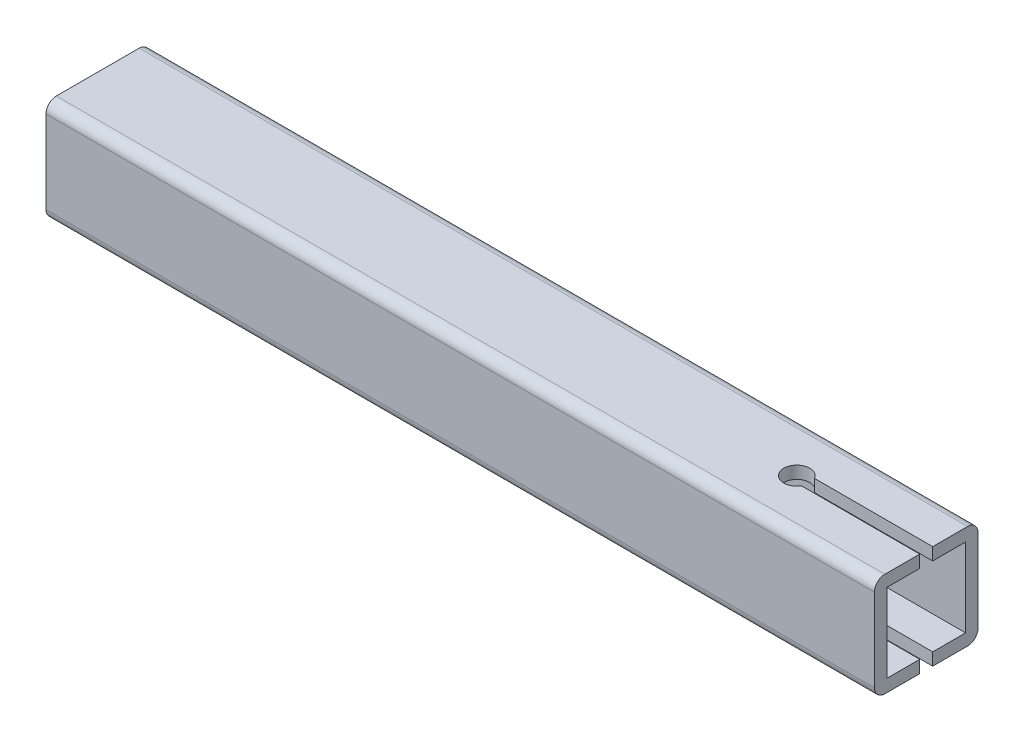
ISO-10303-21;
HEADER;
FILE_DESCRIPTION(('STEP AP214'),'2;1');
FILE_NAME('part.step','',(''),(''),'','','');
FILE_SCHEMA(('AUTOMOTIVE_DESIGN { 1 0 10303 214 1 1 1 1 }'));
ENDSEC;
DATA;
#1=APPLICATION_CONTEXT('core data for automotive mechanical design processes');
#2=APPLICATION_PROTOCOL_DEFINITION('international standard','automotive_design',2000,#1);
#3=PRODUCT_CONTEXT('',#1,'mechanical');
#4=PRODUCT('Part','Part','',(#3));
#5=PRODUCT_RELATED_PRODUCT_CATEGORY('part','',(#4));
#6=PRODUCT_DEFINITION_FORMATION('','',#4);
#7=PRODUCT_DEFINITION_CONTEXT('part definition',#1,'design');
#8=PRODUCT_DEFINITION('design','',#6,#7);
#9=PRODUCT_DEFINITION_SHAPE('','',#8);
#10=(LENGTH_UNIT() NAMED_UNIT(*) SI_UNIT(.MILLI.,.METRE.));
#11=(NAMED_UNIT(*) PLANE_ANGLE_UNIT() SI_UNIT($,.RADIAN.));
#12=(NAMED_UNIT(*) SI_UNIT($,.STERADIAN.) SOLID_ANGLE_UNIT());
#13=UNCERTAINTY_MEASURE_WITH_UNIT(LENGTH_MEASURE(1.E-05),#10,'distance_accuracy_value','');
#14=(GEOMETRIC_REPRESENTATION_CONTEXT(3) GLOBAL_UNCERTAINTY_ASSIGNED_CONTEXT((#13)) GLOBAL_UNIT_ASSIGNED_CONTEXT((#10,
#11,#12)) REPRESENTATION_CONTEXT('',''));
#15=CARTESIAN_POINT('',(0.,0.,0.));
#16=DIRECTION('',(0.,0.,1.));
#17=DIRECTION('',(1.,0.,0.));
#18=AXIS2_PLACEMENT_3D('',#15,#16,#17);
#19=CARTESIAN_POINT('',(203.2,2.54,22.86));
#20=DIRECTION('',(1.,0.,0.));
#21=DIRECTION('',(0.,0.,-1.));
#22=AXIS2_PLACEMENT_3D('',#19,#20,#21);
#23=PLANE('',#22);
#24=DIRECTION('',(0.,1.,0.));
#25=VECTOR('',#24,1.);
#26=CARTESIAN_POINT('',(203.2,0.,14.2875));
#27=LINE('',#26,#25);
#28=CARTESIAN_POINT('',(203.2,22.352,14.2875));
#29=VERTEX_POINT('',#28);
#30=CARTESIAN_POINT('',(203.2,25.4,14.2875));
#31=VERTEX_POINT('',#30);
#32=EDGE_CURVE('E327',#29,#31,#27,.T.);
#33=ORIENTED_EDGE('',*,*,#32,.T.);
#34=DIRECTION('',(0.,0.,1.));
#35=VECTOR('',#34,1.);
#36=CARTESIAN_POINT('',(203.2,25.4,2.54));
#37=LINE('',#36,#35);
#38=CARTESIAN_POINT('',(203.2,25.4,22.86));
#39=VERTEX_POINT('',#38);
#40=EDGE_CURVE('E247',#31,#39,#37,.T.);
#41=ORIENTED_EDGE('',*,*,#40,.T.);
#42=CARTESIAN_POINT('',(203.2,22.86,22.86));
#43=DIRECTION('',(1.,0.,0.));
#44=DIRECTION('',(0.,0.,1.));
#45=AXIS2_PLACEMENT_3D('',#42,#43,#44);
#46=CIRCLE('',#45,2.54);
#47=CARTESIAN_POINT('',(203.2,22.86,25.4));
#48=VERTEX_POINT('',#47);
#49=EDGE_CURVE('E251',#39,#48,#46,.T.);
#50=ORIENTED_EDGE('',*,*,#49,.T.);
#51=DIRECTION('',(0.,-1.,0.));
#52=VECTOR('',#51,1.);
#53=CARTESIAN_POINT('',(203.2,22.86,25.4));
#54=LINE('',#53,#52);
#55=CARTESIAN_POINT('',(203.2,2.54,25.4));
#56=VERTEX_POINT('',#55);
#57=EDGE_CURVE('E253',#48,#56,#54,.T.);
#58=ORIENTED_EDGE('',*,*,#57,.T.);
#59=CARTESIAN_POINT('',(203.2,2.54,22.86));
#60=DIRECTION('',(1.,0.,0.));
#61=DIRECTION('',(0.,0.,-1.));
#62=AXIS2_PLACEMENT_3D('',#59,#60,#61);
#63=CIRCLE('',#62,2.54);
#64=CARTESIAN_POINT('',(203.2,0.,22.86));
#65=VERTEX_POINT('',#64);
#66=EDGE_CURVE('E233',#56,#65,#63,.T.);
#67=ORIENTED_EDGE('',*,*,#66,.T.);
#68=DIRECTION('',(0.,0.,-1.));
#69=VECTOR('',#68,1.);
#70=CARTESIAN_POINT('',(203.2,0.,22.86));
#71=LINE('',#70,#69);
#72=CARTESIAN_POINT('',(203.2,0.,14.2875));
#73=VERTEX_POINT('',#72);
#74=EDGE_CURVE('E238',#65,#73,#71,.T.);
#75=ORIENTED_EDGE('',*,*,#74,.T.);
#76=CARTESIAN_POINT('',(203.2,3.048,14.2875));
#77=VERTEX_POINT('',#76);
#78=EDGE_CURVE('E318',#73,#77,#27,.T.);
#79=ORIENTED_EDGE('',*,*,#78,.T.);
#80=DIRECTION('',(0.,0.,-1.));
#81=VECTOR('',#80,1.);
#82=CARTESIAN_POINT('',(203.2,3.048,22.352));
#83=LINE('',#82,#81);
#84=CARTESIAN_POINT('',(203.2,3.048,22.352));
#85=VERTEX_POINT('',#84);
#86=EDGE_CURVE('E211',#85,#77,#83,.T.);
#87=ORIENTED_EDGE('',*,*,#86,.F.);
#88=DIRECTION('',(0.,-1.,0.));
#89=VECTOR('',#88,1.);
#90=CARTESIAN_POINT('',(203.2,22.352,22.352));
#91=LINE('',#90,#89);
#92=CARTESIAN_POINT('',(203.2,22.352,22.352));
#93=VERTEX_POINT('',#92);
#94=EDGE_CURVE('E200',#93,#85,#91,.T.);
#95=ORIENTED_EDGE('',*,*,#94,.F.);
#96=DIRECTION('',(0.,0.,1.));
#97=VECTOR('',#96,1.);
#98=CARTESIAN_POINT('',(203.2,22.352,3.048));
#99=LINE('',#98,#97);
#100=EDGE_CURVE('E184',#29,#93,#99,.T.);
#101=ORIENTED_EDGE('',*,*,#100,.F.);
#102=EDGE_LOOP('',(#33,#41,#50,#58,#67,#75,#79,#87,#95,#101));
#103=FACE_BOUND('',#102,.T.);
#104=ADVANCED_FACE('F41',(#103),#23,.T.);
#105=DIRECTION('',(0.,1.,0.));
#106=VECTOR('',#105,1.);
#107=CARTESIAN_POINT('',(203.2,0.,11.1125));
#108=LINE('',#107,#106);
#109=CARTESIAN_POINT('',(203.2,0.,11.1125));
#110=VERTEX_POINT('',#109);
#111=CARTESIAN_POINT('',(203.2,3.048,11.1125));
#112=VERTEX_POINT('',#111);
#113=EDGE_CURVE('E59',#110,#112,#108,.T.);
#114=ORIENTED_EDGE('',*,*,#113,.F.);
#115=CARTESIAN_POINT('',(203.2,0.,2.54000000000002));
#116=VERTEX_POINT('',#115);
#117=EDGE_CURVE('E236',#110,#116,#71,.T.);
#118=ORIENTED_EDGE('',*,*,#117,.T.);
#119=CARTESIAN_POINT('',(203.2,2.54,2.54));
#120=DIRECTION('',(1.,0.,0.));
#121=DIRECTION('',(0.,0.,1.));
#122=AXIS2_PLACEMENT_3D('',#119,#120,#121);
#123=CIRCLE('',#122,2.54);
#124=CARTESIAN_POINT('',(203.2,2.54000000000002,0.));
#125=VERTEX_POINT('',#124);
#126=EDGE_CURVE('E241',#116,#125,#123,.T.);
#127=ORIENTED_EDGE('',*,*,#126,.T.);
#128=DIRECTION('',(0.,1.,0.));
#129=VECTOR('',#128,1.);
#130=CARTESIAN_POINT('',(203.2,2.54000000000002,0.));
#131=LINE('',#130,#129);
#132=CARTESIAN_POINT('',(203.2,22.86,0.));
#133=VERTEX_POINT('',#132);
#134=EDGE_CURVE('E243',#125,#133,#131,.T.);
#135=ORIENTED_EDGE('',*,*,#134,.T.);
#136=CARTESIAN_POINT('',(203.2,22.86,2.54));
#137=DIRECTION('',(1.,0.,0.));
#138=DIRECTION('',(0.,0.,-1.));
#139=AXIS2_PLACEMENT_3D('',#136,#137,#138);
#140=CIRCLE('',#139,2.54);
#141=CARTESIAN_POINT('',(203.2,25.4,2.54));
#142=VERTEX_POINT('',#141);
#143=EDGE_CURVE('E245',#133,#142,#140,.T.);
#144=ORIENTED_EDGE('',*,*,#143,.T.);
#145=CARTESIAN_POINT('',(203.2,25.4,11.1125));
#146=VERTEX_POINT('',#145);
#147=EDGE_CURVE('E248',#142,#146,#37,.T.);
#148=ORIENTED_EDGE('',*,*,#147,.T.);
#149=CARTESIAN_POINT('',(203.2,22.352,11.1125));
#150=VERTEX_POINT('',#149);
#151=EDGE_CURVE('E306',#150,#146,#108,.T.);
#152=ORIENTED_EDGE('',*,*,#151,.F.);
#153=CARTESIAN_POINT('',(203.2,22.352,3.048));
#154=VERTEX_POINT('',#153);
#155=EDGE_CURVE('E194',#154,#150,#99,.T.);
#156=ORIENTED_EDGE('',*,*,#155,.F.);
#157=DIRECTION('',(0.,1.,0.));
#158=VECTOR('',#157,1.);
#159=CARTESIAN_POINT('',(203.2,3.048,3.048));
#160=LINE('',#159,#158);
#161=CARTESIAN_POINT('',(203.2,3.048,3.048));
#162=VERTEX_POINT('',#161);
#163=EDGE_CURVE('E195',#162,#154,#160,.T.);
#164=ORIENTED_EDGE('',*,*,#163,.F.);
#165=EDGE_CURVE('E226',#112,#162,#83,.T.);
#166=ORIENTED_EDGE('',*,*,#165,.F.);
#167=EDGE_LOOP('',(#114,#118,#127,#135,#144,#148,#152,#156,#164,#166));
#168=FACE_BOUND('',#167,.T.);
#169=ADVANCED_FACE('F308',(#168),#23,.T.);
#170=CARTESIAN_POINT('',(0.,2.54,22.86));
#171=DIRECTION('',(1.,0.,0.));
#172=DIRECTION('',(0.,0.,-1.));
#173=AXIS2_PLACEMENT_3D('',#170,#171,#172);
#174=PLANE('',#173);
#175=CARTESIAN_POINT('',(0.,2.54,22.86));
#176=DIRECTION('',(1.,0.,0.));
#177=DIRECTION('',(0.,0.,-1.));
#178=AXIS2_PLACEMENT_3D('',#175,#176,#177);
#179=CIRCLE('',#178,2.54);
#180=CARTESIAN_POINT('',(0.,2.54,25.4));
#181=VERTEX_POINT('',#180);
#182=CARTESIAN_POINT('',(0.,0.,22.86));
#183=VERTEX_POINT('',#182);
#184=EDGE_CURVE('E232',#181,#183,#179,.T.);
#185=ORIENTED_EDGE('',*,*,#184,.F.);
#186=DIRECTION('',(0.,-1.,0.));
#187=VECTOR('',#186,1.);
#188=CARTESIAN_POINT('',(0.,22.86,25.4));
#189=LINE('',#188,#187);
#190=CARTESIAN_POINT('',(0.,22.86,25.4));
#191=VERTEX_POINT('',#190);
#192=EDGE_CURVE('E237',#191,#181,#189,.T.);
#193=ORIENTED_EDGE('',*,*,#192,.F.);
#194=CARTESIAN_POINT('',(0.,22.86,22.86));
#195=DIRECTION('',(1.,0.,0.));
#196=DIRECTION('',(0.,0.,1.));
#197=AXIS2_PLACEMENT_3D('',#194,#195,#196);
#198=CIRCLE('',#197,2.54);
#199=CARTESIAN_POINT('',(0.,25.4,22.86));
#200=VERTEX_POINT('',#199);
#201=EDGE_CURVE('E268',#200,#191,#198,.T.);
#202=ORIENTED_EDGE('',*,*,#201,.F.);
#203=DIRECTION('',(0.,0.,1.));
#204=VECTOR('',#203,1.);
#205=CARTESIAN_POINT('',(0.,25.4,2.54));
#206=LINE('',#205,#204);
#207=CARTESIAN_POINT('',(0.,25.4,2.54));
#208=VERTEX_POINT('',#207);
#209=EDGE_CURVE('E266',#208,#200,#206,.T.);
#210=ORIENTED_EDGE('',*,*,#209,.F.);
#211=CARTESIAN_POINT('',(0.,22.86,2.54));
#212=DIRECTION('',(1.,0.,0.));
#213=DIRECTION('',(0.,0.,-1.));
#214=AXIS2_PLACEMENT_3D('',#211,#212,#213);
#215=CIRCLE('',#214,2.54);
#216=CARTESIAN_POINT('',(0.,22.86,0.));
#217=VERTEX_POINT('',#216);
#218=EDGE_CURVE('E264',#217,#208,#215,.T.);
#219=ORIENTED_EDGE('',*,*,#218,.F.);
#220=DIRECTION('',(0.,1.,0.));
#221=VECTOR('',#220,1.);
#222=CARTESIAN_POINT('',(0.,2.54000000000002,0.));
#223=LINE('',#222,#221);
#224=CARTESIAN_POINT('',(0.,2.54000000000002,0.));
#225=VERTEX_POINT('',#224);
#226=EDGE_CURVE('E262',#225,#217,#223,.T.);
#227=ORIENTED_EDGE('',*,*,#226,.F.);
#228=CARTESIAN_POINT('',(0.,2.54,2.54));
#229=DIRECTION('',(1.,0.,0.));
#230=DIRECTION('',(0.,0.,1.));
#231=AXIS2_PLACEMENT_3D('',#228,#229,#230);
#232=CIRCLE('',#231,2.54);
#233=CARTESIAN_POINT('',(0.,0.,2.54000000000002));
#234=VERTEX_POINT('',#233);
#235=EDGE_CURVE('E260',#234,#225,#232,.T.);
#236=ORIENTED_EDGE('',*,*,#235,.F.);
#237=DIRECTION('',(0.,0.,-1.));
#238=VECTOR('',#237,1.);
#239=CARTESIAN_POINT('',(0.,0.,22.86));
#240=LINE('',#239,#238);
#241=EDGE_CURVE('E258',#183,#234,#240,.T.);
#242=ORIENTED_EDGE('',*,*,#241,.F.);
#243=EDGE_LOOP('',(#185,#193,#202,#210,#219,#227,#236,#242));
#244=FACE_BOUND('',#243,.T.);
#245=DIRECTION('',(0.,0.,-1.));
#246=VECTOR('',#245,1.);
#247=CARTESIAN_POINT('',(0.,3.048,22.352));
#248=LINE('',#247,#246);
#249=CARTESIAN_POINT('',(0.,3.048,22.352));
#250=VERTEX_POINT('',#249);
#251=CARTESIAN_POINT('',(0.,3.048,3.048));
#252=VERTEX_POINT('',#251);
#253=EDGE_CURVE('E217',#250,#252,#248,.T.);
#254=ORIENTED_EDGE('',*,*,#253,.T.);
#255=DIRECTION('',(0.,1.,0.));
#256=VECTOR('',#255,1.);
#257=CARTESIAN_POINT('',(0.,3.048,3.048));
#258=LINE('',#257,#256);
#259=CARTESIAN_POINT('',(0.,22.352,3.048));
#260=VERTEX_POINT('',#259);
#261=EDGE_CURVE('E220',#252,#260,#258,.T.);
#262=ORIENTED_EDGE('',*,*,#261,.T.);
#263=DIRECTION('',(0.,0.,1.));
#264=VECTOR('',#263,1.);
#265=CARTESIAN_POINT('',(0.,22.352,3.048));
#266=LINE('',#265,#264);
#267=CARTESIAN_POINT('',(0.,22.352,22.352));
#268=VERTEX_POINT('',#267);
#269=EDGE_CURVE('E224',#260,#268,#266,.T.);
#270=ORIENTED_EDGE('',*,*,#269,.T.);
#271=DIRECTION('',(0.,-1.,0.));
#272=VECTOR('',#271,1.);
#273=CARTESIAN_POINT('',(0.,22.352,22.352));
#274=LINE('',#273,#272);
#275=EDGE_CURVE('E203',#268,#250,#274,.T.);
#276=ORIENTED_EDGE('',*,*,#275,.T.);
#277=EDGE_LOOP('',(#254,#262,#270,#276));
#278=FACE_BOUND('',#277,.T.);
#279=ADVANCED_FACE('F344',(#244,#278),#174,.F.);
#280=CARTESIAN_POINT('',(203.2,2.54,22.86));
#281=DIRECTION('',(-1.,0.,0.));
#282=DIRECTION('',(0.,0.,1.));
#283=AXIS2_PLACEMENT_3D('',#280,#281,#282);
#284=CYLINDRICAL_SURFACE('',#283,2.54);
#285=ORIENTED_EDGE('',*,*,#184,.T.);
#286=DIRECTION('',(-1.,0.,0.));
#287=VECTOR('',#286,1.);
#288=CARTESIAN_POINT('',(203.2,0.,22.86));
#289=LINE('',#288,#287);
#290=EDGE_CURVE('E291',#65,#183,#289,.T.);
#291=ORIENTED_EDGE('',*,*,#290,.F.);
#292=ORIENTED_EDGE('',*,*,#66,.F.);
#293=DIRECTION('',(-1.,0.,0.));
#294=VECTOR('',#293,1.);
#295=CARTESIAN_POINT('',(203.2,2.54,25.4));
#296=LINE('',#295,#294);
#297=EDGE_CURVE('E255',#56,#181,#296,.T.);
#298=ORIENTED_EDGE('',*,*,#297,.T.);
#299=EDGE_LOOP('',(#285,#291,#292,#298));
#300=FACE_BOUND('',#299,.T.);
#301=ADVANCED_FACE('F43',(#300),#284,.T.);
#302=CARTESIAN_POINT('',(203.2,0.,22.86));
#303=DIRECTION('',(0.,1.,0.));
#304=DIRECTION('',(0.,0.,1.));
#305=AXIS2_PLACEMENT_3D('',#302,#303,#304);
#306=PLANE('',#305);
#307=CARTESIAN_POINT('',(171.45,0.,12.7));
#308=DIRECTION('',(0.,1.,0.));
#309=DIRECTION('',(0.,0.,1.));
#310=AXIS2_PLACEMENT_3D('',#307,#308,#309);
#311=CIRCLE('',#310,3.17499999999999);
#312=CARTESIAN_POINT('',(174.199630657016,0.,11.1125));
#313=VERTEX_POINT('',#312);
#314=CARTESIAN_POINT('',(174.199630657016,0.,14.2875));
#315=VERTEX_POINT('',#314);
#316=EDGE_CURVE('E314',#313,#315,#311,.T.);
#317=ORIENTED_EDGE('',*,*,#316,.T.);
#318=DIRECTION('',(1.,0.,0.));
#319=VECTOR('',#318,1.);
#320=CARTESIAN_POINT('',(203.2,0.,14.2875));
#321=LINE('',#320,#319);
#322=EDGE_CURVE('E311',#315,#73,#321,.T.);
#323=ORIENTED_EDGE('',*,*,#322,.T.);
#324=ORIENTED_EDGE('',*,*,#74,.F.);
#325=ORIENTED_EDGE('',*,*,#290,.T.);
#326=ORIENTED_EDGE('',*,*,#241,.T.);
#327=DIRECTION('',(-1.,0.,0.));
#328=VECTOR('',#327,1.);
#329=CARTESIAN_POINT('',(203.2,0.,2.54000000000002));
#330=LINE('',#329,#328);
#331=EDGE_CURVE('E288',#116,#234,#330,.T.);
#332=ORIENTED_EDGE('',*,*,#331,.F.);
#333=ORIENTED_EDGE('',*,*,#117,.F.);
#334=DIRECTION('',(-1.,0.,0.));
#335=VECTOR('',#334,1.);
#336=CARTESIAN_POINT('',(203.2,0.,11.1125));
#337=LINE('',#336,#335);
#338=EDGE_CURVE('E83',#110,#313,#337,.T.);
#339=ORIENTED_EDGE('',*,*,#338,.T.);
#340=EDGE_LOOP('',(#317,#323,#324,#325,#326,#332,#333,#339));
#341=FACE_BOUND('',#340,.T.);
#342=ADVANCED_FACE('F353',(#341),#306,.F.);
#343=CARTESIAN_POINT('',(203.2,2.54,2.54));
#344=DIRECTION('',(-1.,0.,0.));
#345=DIRECTION('',(0.,0.,1.));
#346=AXIS2_PLACEMENT_3D('',#343,#344,#345);
#347=CYLINDRICAL_SURFACE('',#346,2.54);
#348=ORIENTED_EDGE('',*,*,#235,.T.);
#349=DIRECTION('',(-1.,0.,0.));
#350=VECTOR('',#349,1.);
#351=CARTESIAN_POINT('',(203.2,2.54000000000002,0.));
#352=LINE('',#351,#350);
#353=EDGE_CURVE('E285',#125,#225,#352,.T.);
#354=ORIENTED_EDGE('',*,*,#353,.F.);
#355=ORIENTED_EDGE('',*,*,#126,.F.);
#356=ORIENTED_EDGE('',*,*,#331,.T.);
#357=EDGE_LOOP('',(#348,#354,#355,#356));
#358=FACE_BOUND('',#357,.T.);
#359=ADVANCED_FACE('F358',(#358),#347,.T.);
#360=CARTESIAN_POINT('',(203.2,2.54000000000002,0.));
#361=DIRECTION('',(0.,0.,1.));
#362=DIRECTION('',(1.,0.,0.));
#363=AXIS2_PLACEMENT_3D('',#360,#361,#362);
#364=PLANE('',#363);
#365=ORIENTED_EDGE('',*,*,#226,.T.);
#366=DIRECTION('',(-1.,0.,0.));
#367=VECTOR('',#366,1.);
#368=CARTESIAN_POINT('',(203.2,22.86,0.));
#369=LINE('',#368,#367);
#370=EDGE_CURVE('E282',#133,#217,#369,.T.);
#371=ORIENTED_EDGE('',*,*,#370,.F.);
#372=ORIENTED_EDGE('',*,*,#134,.F.);
#373=ORIENTED_EDGE('',*,*,#353,.T.);
#374=EDGE_LOOP('',(#365,#371,#372,#373));
#375=FACE_BOUND('',#374,.T.);
#376=ADVANCED_FACE('F364',(#375),#364,.F.);
#377=CARTESIAN_POINT('',(203.2,22.86,2.54));
#378=DIRECTION('',(-1.,0.,0.));
#379=DIRECTION('',(0.,0.,1.));
#380=AXIS2_PLACEMENT_3D('',#377,#378,#379);
#381=CYLINDRICAL_SURFACE('',#380,2.54);
#382=ORIENTED_EDGE('',*,*,#218,.T.);
#383=DIRECTION('',(-1.,0.,0.));
#384=VECTOR('',#383,1.);
#385=CARTESIAN_POINT('',(203.2,25.4,2.54));
#386=LINE('',#385,#384);
#387=EDGE_CURVE('E279',#142,#208,#386,.T.);
#388=ORIENTED_EDGE('',*,*,#387,.F.);
#389=ORIENTED_EDGE('',*,*,#143,.F.);
#390=ORIENTED_EDGE('',*,*,#370,.T.);
#391=EDGE_LOOP('',(#382,#388,#389,#390));
#392=FACE_BOUND('',#391,.T.);
#393=ADVANCED_FACE('F368',(#392),#381,.T.);
#394=CARTESIAN_POINT('',(203.2,25.4,2.54));
#395=DIRECTION('',(0.,-1.,0.));
#396=DIRECTION('',(0.,0.,-1.));
#397=AXIS2_PLACEMENT_3D('',#394,#395,#396);
#398=PLANE('',#397);
#399=ORIENTED_EDGE('',*,*,#40,.F.);
#400=DIRECTION('',(-1.,0.,0.));
#401=VECTOR('',#400,1.);
#402=CARTESIAN_POINT('',(203.2,25.4,14.2875));
#403=LINE('',#402,#401);
#404=CARTESIAN_POINT('',(174.199630657016,25.4,14.2875));
#405=VERTEX_POINT('',#404);
#406=EDGE_CURVE('E221',#31,#405,#403,.T.);
#407=ORIENTED_EDGE('',*,*,#406,.T.);
#408=CARTESIAN_POINT('',(171.45,25.4,12.7));
#409=DIRECTION('',(0.,1.,0.));
#410=DIRECTION('',(0.,0.,1.));
#411=AXIS2_PLACEMENT_3D('',#408,#409,#410);
#412=CIRCLE('',#411,3.17499999999999);
#413=CARTESIAN_POINT('',(174.199630657016,25.4,11.1125));
#414=VERTEX_POINT('',#413);
#415=EDGE_CURVE('E45',#414,#405,#412,.T.);
#416=ORIENTED_EDGE('',*,*,#415,.F.);
#417=DIRECTION('',(1.,0.,0.));
#418=VECTOR('',#417,1.);
#419=CARTESIAN_POINT('',(203.2,25.4,11.1125));
#420=LINE('',#419,#418);
#421=EDGE_CURVE('E70',#414,#146,#420,.T.);
#422=ORIENTED_EDGE('',*,*,#421,.T.);
#423=ORIENTED_EDGE('',*,*,#147,.F.);
#424=ORIENTED_EDGE('',*,*,#387,.T.);
#425=ORIENTED_EDGE('',*,*,#209,.T.);
#426=DIRECTION('',(-1.,0.,0.));
#427=VECTOR('',#426,1.);
#428=CARTESIAN_POINT('',(203.2,25.4,22.86));
#429=LINE('',#428,#427);
#430=EDGE_CURVE('E276',#39,#200,#429,.T.);
#431=ORIENTED_EDGE('',*,*,#430,.F.);
#432=EDGE_LOOP('',(#399,#407,#416,#422,#423,#424,#425,#431));
#433=FACE_BOUND('',#432,.T.);
#434=ADVANCED_FACE('F372',(#433),#398,.F.);
#435=CARTESIAN_POINT('',(203.2,22.86,22.86));
#436=DIRECTION('',(-1.,0.,0.));
#437=DIRECTION('',(0.,0.,1.));
#438=AXIS2_PLACEMENT_3D('',#435,#436,#437);
#439=CYLINDRICAL_SURFACE('',#438,2.54);
#440=ORIENTED_EDGE('',*,*,#201,.T.);
#441=DIRECTION('',(-1.,0.,0.));
#442=VECTOR('',#441,1.);
#443=CARTESIAN_POINT('',(203.2,22.86,25.4));
#444=LINE('',#443,#442);
#445=EDGE_CURVE('E273',#48,#191,#444,.T.);
#446=ORIENTED_EDGE('',*,*,#445,.F.);
#447=ORIENTED_EDGE('',*,*,#49,.F.);
#448=ORIENTED_EDGE('',*,*,#430,.T.);
#449=EDGE_LOOP('',(#440,#446,#447,#448));
#450=FACE_BOUND('',#449,.T.);
#451=ADVANCED_FACE('F405',(#450),#439,.T.);
#452=CARTESIAN_POINT('',(203.2,22.86,25.4));
#453=DIRECTION('',(0.,0.,-1.));
#454=DIRECTION('',(0.,1.,0.));
#455=AXIS2_PLACEMENT_3D('',#452,#453,#454);
#456=PLANE('',#455);
#457=ORIENTED_EDGE('',*,*,#192,.T.);
#458=ORIENTED_EDGE('',*,*,#297,.F.);
#459=ORIENTED_EDGE('',*,*,#57,.F.);
#460=ORIENTED_EDGE('',*,*,#445,.T.);
#461=EDGE_LOOP('',(#457,#458,#459,#460));
#462=FACE_BOUND('',#461,.T.);
#463=ADVANCED_FACE('F402',(#462),#456,.F.);
#464=CARTESIAN_POINT('',(203.2,3.048,22.352));
#465=DIRECTION('',(0.,1.,0.));
#466=DIRECTION('',(0.,0.,1.));
#467=AXIS2_PLACEMENT_3D('',#464,#465,#466);
#468=PLANE('',#467);
#469=DIRECTION('',(1.,0.,0.));
#470=VECTOR('',#469,1.);
#471=CARTESIAN_POINT('',(203.2,3.048,14.2875));
#472=LINE('',#471,#470);
#473=CARTESIAN_POINT('',(174.199630657016,3.048,14.2875));
#474=VERTEX_POINT('',#473);
#475=EDGE_CURVE('E335',#474,#77,#472,.T.);
#476=ORIENTED_EDGE('',*,*,#475,.F.);
#477=CARTESIAN_POINT('',(171.45,3.048,12.7));
#478=DIRECTION('',(0.,1.,0.));
#479=DIRECTION('',(0.,0.,1.));
#480=AXIS2_PLACEMENT_3D('',#477,#478,#479);
#481=CIRCLE('',#480,3.17499999999999);
#482=CARTESIAN_POINT('',(174.199630657016,3.048,11.1125));
#483=VERTEX_POINT('',#482);
#484=EDGE_CURVE('E333',#483,#474,#481,.T.);
#485=ORIENTED_EDGE('',*,*,#484,.F.);
#486=DIRECTION('',(-1.,0.,0.));
#487=VECTOR('',#486,1.);
#488=CARTESIAN_POINT('',(203.2,3.048,11.1125));
#489=LINE('',#488,#487);
#490=EDGE_CURVE('E330',#112,#483,#489,.T.);
#491=ORIENTED_EDGE('',*,*,#490,.F.);
#492=ORIENTED_EDGE('',*,*,#165,.T.);
#493=DIRECTION('',(-1.,0.,0.));
#494=VECTOR('',#493,1.);
#495=CARTESIAN_POINT('',(203.2,3.048,3.048));
#496=LINE('',#495,#494);
#497=EDGE_CURVE('E229',#162,#252,#496,.T.);
#498=ORIENTED_EDGE('',*,*,#497,.T.);
#499=ORIENTED_EDGE('',*,*,#253,.F.);
#500=DIRECTION('',(-1.,0.,0.));
#501=VECTOR('',#500,1.);
#502=CARTESIAN_POINT('',(203.2,3.048,22.352));
#503=LINE('',#502,#501);
#504=EDGE_CURVE('E206',#85,#250,#503,.T.);
#505=ORIENTED_EDGE('',*,*,#504,.F.);
#506=ORIENTED_EDGE('',*,*,#86,.T.);
#507=EDGE_LOOP('',(#476,#485,#491,#492,#498,#499,#505,#506));
#508=FACE_BOUND('',#507,.T.);
#509=ADVANCED_FACE('F347',(#508),#468,.T.);
#510=CARTESIAN_POINT('',(203.2,3.048,3.048));
#511=DIRECTION('',(0.,0.,1.));
#512=DIRECTION('',(1.,0.,0.));
#513=AXIS2_PLACEMENT_3D('',#510,#511,#512);
#514=PLANE('',#513);
#515=ORIENTED_EDGE('',*,*,#261,.F.);
#516=ORIENTED_EDGE('',*,*,#497,.F.);
#517=ORIENTED_EDGE('',*,*,#163,.T.);
#518=DIRECTION('',(-1.,0.,0.));
#519=VECTOR('',#518,1.);
#520=CARTESIAN_POINT('',(203.2,22.352,3.048));
#521=LINE('',#520,#519);
#522=EDGE_CURVE('E205',#154,#260,#521,.T.);
#523=ORIENTED_EDGE('',*,*,#522,.T.);
#524=EDGE_LOOP('',(#515,#516,#517,#523));
#525=FACE_BOUND('',#524,.T.);
#526=ADVANCED_FACE('F341',(#525),#514,.T.);
#527=CARTESIAN_POINT('',(203.2,22.352,3.048));
#528=DIRECTION('',(0.,-1.,0.));
#529=DIRECTION('',(0.,0.,-1.));
#530=AXIS2_PLACEMENT_3D('',#527,#528,#529);
#531=PLANE('',#530);
#532=DIRECTION('',(-1.,0.,0.));
#533=VECTOR('',#532,1.);
#534=CARTESIAN_POINT('',(203.2,22.352,14.2875));
#535=LINE('',#534,#533);
#536=CARTESIAN_POINT('',(174.199630657016,22.352,14.2875));
#537=VERTEX_POINT('',#536);
#538=EDGE_CURVE('E11',#29,#537,#535,.T.);
#539=ORIENTED_EDGE('',*,*,#538,.F.);
#540=ORIENTED_EDGE('',*,*,#100,.T.);
#541=DIRECTION('',(-1.,0.,0.));
#542=VECTOR('',#541,1.);
#543=CARTESIAN_POINT('',(203.2,22.352,22.352));
#544=LINE('',#543,#542);
#545=EDGE_CURVE('E188',#93,#268,#544,.T.);
#546=ORIENTED_EDGE('',*,*,#545,.T.);
#547=ORIENTED_EDGE('',*,*,#269,.F.);
#548=ORIENTED_EDGE('',*,*,#522,.F.);
#549=ORIENTED_EDGE('',*,*,#155,.T.);
#550=DIRECTION('',(1.,0.,0.));
#551=VECTOR('',#550,1.);
#552=CARTESIAN_POINT('',(203.2,22.352,11.1125));
#553=LINE('',#552,#551);
#554=CARTESIAN_POINT('',(174.199630657016,22.352,11.1125));
#555=VERTEX_POINT('',#554);
#556=EDGE_CURVE('E294',#555,#150,#553,.T.);
#557=ORIENTED_EDGE('',*,*,#556,.F.);
#558=CARTESIAN_POINT('',(171.45,22.352,12.7));
#559=DIRECTION('',(0.,-1.,0.));
#560=DIRECTION('',(0.,0.,-1.));
#561=AXIS2_PLACEMENT_3D('',#558,#559,#560);
#562=CIRCLE('',#561,3.17499999999999);
#563=EDGE_CURVE('E51',#537,#555,#562,.T.);
#564=ORIENTED_EDGE('',*,*,#563,.F.);
#565=EDGE_LOOP('',(#539,#540,#546,#547,#548,#549,#557,#564));
#566=FACE_BOUND('',#565,.T.);
#567=ADVANCED_FACE('F186',(#566),#531,.T.);
#568=CARTESIAN_POINT('',(203.2,22.352,22.352));
#569=DIRECTION('',(0.,0.,-1.));
#570=DIRECTION('',(0.,1.,0.));
#571=AXIS2_PLACEMENT_3D('',#568,#569,#570);
#572=PLANE('',#571);
#573=ORIENTED_EDGE('',*,*,#275,.F.);
#574=ORIENTED_EDGE('',*,*,#545,.F.);
#575=ORIENTED_EDGE('',*,*,#94,.T.);
#576=ORIENTED_EDGE('',*,*,#504,.T.);
#577=EDGE_LOOP('',(#573,#574,#575,#576));
#578=FACE_BOUND('',#577,.T.);
#579=ADVANCED_FACE('F198',(#578),#572,.T.);
#580=CARTESIAN_POINT('',(203.2,0.,11.1125));
#581=DIRECTION('',(0.,0.,-1.));
#582=DIRECTION('',(-1.,0.,0.));
#583=AXIS2_PLACEMENT_3D('',#580,#581,#582);
#584=PLANE('',#583);
#585=DIRECTION('',(0.,1.,0.));
#586=VECTOR('',#585,1.);
#587=CARTESIAN_POINT('',(174.199630657016,0.,11.1125));
#588=LINE('',#587,#586);
#589=EDGE_CURVE('E300',#555,#414,#588,.T.);
#590=ORIENTED_EDGE('',*,*,#589,.F.);
#591=ORIENTED_EDGE('',*,*,#556,.T.);
#592=ORIENTED_EDGE('',*,*,#151,.T.);
#593=ORIENTED_EDGE('',*,*,#421,.F.);
#594=EDGE_LOOP('',(#590,#591,#592,#593));
#595=FACE_BOUND('',#594,.T.);
#596=ADVANCED_FACE('F305',(#595),#584,.F.);
#597=CARTESIAN_POINT('',(171.45,0.,12.7));
#598=DIRECTION('',(0.,1.,0.));
#599=DIRECTION('',(0.,0.,1.));
#600=AXIS2_PLACEMENT_3D('',#597,#598,#599);
#601=CYLINDRICAL_SURFACE('',#600,3.17499999999999);
#602=DIRECTION('',(0.,1.,0.));
#603=VECTOR('',#602,1.);
#604=CARTESIAN_POINT('',(174.199630657016,0.,14.2875));
#605=LINE('',#604,#603);
#606=EDGE_CURVE('E77',#537,#405,#605,.T.);
#607=ORIENTED_EDGE('',*,*,#606,.F.);
#608=ORIENTED_EDGE('',*,*,#563,.T.);
#609=ORIENTED_EDGE('',*,*,#589,.T.);
#610=ORIENTED_EDGE('',*,*,#415,.T.);
#611=EDGE_LOOP('',(#607,#608,#609,#610));
#612=FACE_BOUND('',#611,.T.);
#613=ADVANCED_FACE('F299',(#612),#601,.F.);
#614=CARTESIAN_POINT('',(203.2,0.,14.2875));
#615=DIRECTION('',(0.,0.,1.));
#616=DIRECTION('',(0.,-1.,0.));
#617=AXIS2_PLACEMENT_3D('',#614,#615,#616);
#618=PLANE('',#617);
#619=ORIENTED_EDGE('',*,*,#32,.F.);
#620=ORIENTED_EDGE('',*,*,#538,.T.);
#621=ORIENTED_EDGE('',*,*,#606,.T.);
#622=ORIENTED_EDGE('',*,*,#406,.F.);
#623=EDGE_LOOP('',(#619,#620,#621,#622));
#624=FACE_BOUND('',#623,.T.);
#625=ADVANCED_FACE('F374',(#624),#618,.F.);
#626=ORIENTED_EDGE('',*,*,#475,.T.);
#627=ORIENTED_EDGE('',*,*,#78,.F.);
#628=ORIENTED_EDGE('',*,*,#322,.F.);
#629=EDGE_CURVE('E324',#315,#474,#605,.T.);
#630=ORIENTED_EDGE('',*,*,#629,.T.);
#631=EDGE_LOOP('',(#626,#627,#628,#630));
#632=FACE_BOUND('',#631,.T.);
#633=ADVANCED_FACE('F377',(#632),#618,.F.);
#634=ORIENTED_EDGE('',*,*,#484,.T.);
#635=ORIENTED_EDGE('',*,*,#629,.F.);
#636=ORIENTED_EDGE('',*,*,#316,.F.);
#637=EDGE_CURVE('E319',#313,#483,#588,.T.);
#638=ORIENTED_EDGE('',*,*,#637,.T.);
#639=EDGE_LOOP('',(#634,#635,#636,#638));
#640=FACE_BOUND('',#639,.T.);
#641=ADVANCED_FACE('F380',(#640),#601,.F.);
#642=ORIENTED_EDGE('',*,*,#490,.T.);
#643=ORIENTED_EDGE('',*,*,#637,.F.);
#644=ORIENTED_EDGE('',*,*,#338,.F.);
#645=ORIENTED_EDGE('',*,*,#113,.T.);
#646=EDGE_LOOP('',(#642,#643,#644,#645));
#647=FACE_BOUND('',#646,.T.);
#648=ADVANCED_FACE('F381',(#647),#584,.F.);
#649=CLOSED_SHELL('',(#104,#169,#279,#301,#342,#359,#376,#393,#434,#451,#463,#509,#526,#567,
#579,#596,#613,#625,#633,#641,#648));
#650=MANIFOLD_SOLID_BREP('B2',#649);
#651=ADVANCED_BREP_SHAPE_REPRESENTATION('',(#18,#650),#14);
#652=SHAPE_DEFINITION_REPRESENTATION(#9,#651);
ENDSEC;
END-ISO-10303-21;
